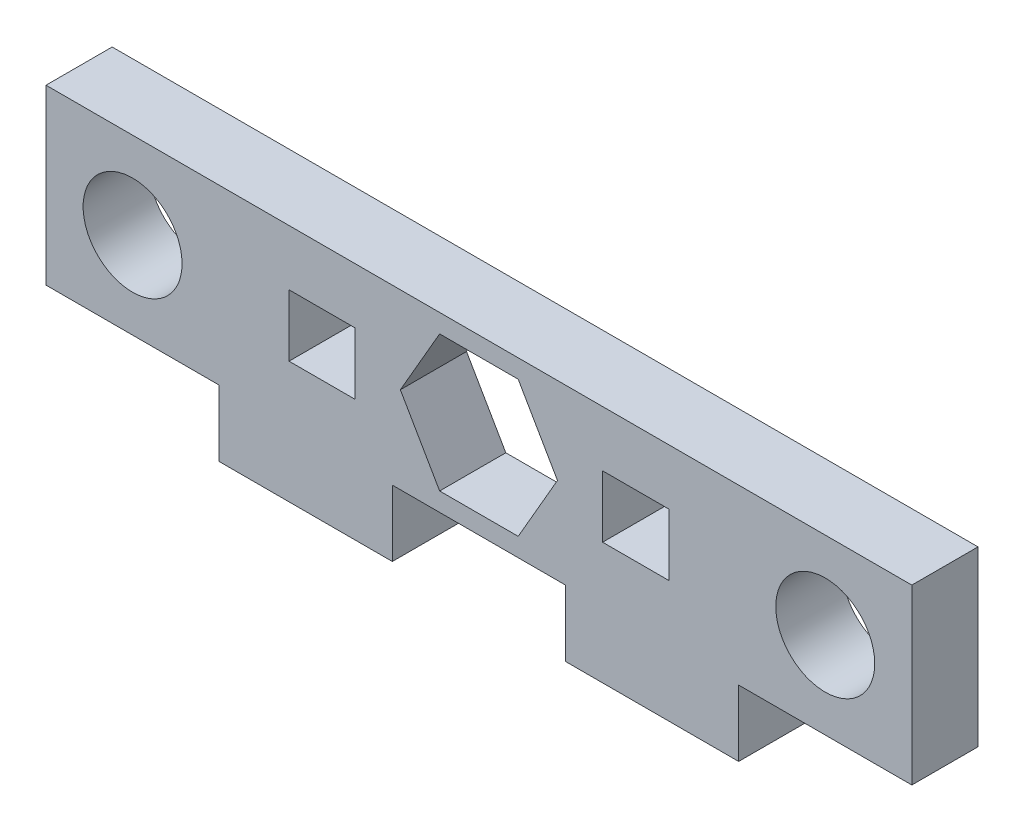
ISO-10303-21;
HEADER;
FILE_DESCRIPTION(('STEP AP214'),'2;1');
FILE_NAME('part.step','',(''),(''),'','','');
FILE_SCHEMA(('AUTOMOTIVE_DESIGN { 1 0 10303 214 1 1 1 1 }'));
ENDSEC;
DATA;
#1=APPLICATION_CONTEXT('core data for automotive mechanical design processes');
#2=APPLICATION_PROTOCOL_DEFINITION('international standard','automotive_design',2000,#1);
#3=PRODUCT_CONTEXT('',#1,'mechanical');
#4=PRODUCT('Part','Part','',(#3));
#5=PRODUCT_RELATED_PRODUCT_CATEGORY('part','',(#4));
#6=PRODUCT_DEFINITION_FORMATION('','',#4);
#7=PRODUCT_DEFINITION_CONTEXT('part definition',#1,'design');
#8=PRODUCT_DEFINITION('design','',#6,#7);
#9=PRODUCT_DEFINITION_SHAPE('','',#8);
#10=(LENGTH_UNIT() NAMED_UNIT(*) SI_UNIT(.MILLI.,.METRE.));
#11=(NAMED_UNIT(*) PLANE_ANGLE_UNIT() SI_UNIT($,.RADIAN.));
#12=(NAMED_UNIT(*) SI_UNIT($,.STERADIAN.) SOLID_ANGLE_UNIT());
#13=UNCERTAINTY_MEASURE_WITH_UNIT(LENGTH_MEASURE(1.E-05),#10,'distance_accuracy_value','');
#14=(GEOMETRIC_REPRESENTATION_CONTEXT(3) GLOBAL_UNCERTAINTY_ASSIGNED_CONTEXT((#13)) GLOBAL_UNIT_ASSIGNED_CONTEXT((#10,
#11,#12)) REPRESENTATION_CONTEXT('',''));
#15=CARTESIAN_POINT('',(0.,0.,0.));
#16=DIRECTION('',(0.,0.,1.));
#17=DIRECTION('',(1.,0.,0.));
#18=AXIS2_PLACEMENT_3D('',#15,#16,#17);
#19=CARTESIAN_POINT('',(0.,0.,5.35));
#20=DIRECTION('',(0.,0.,1.));
#21=DIRECTION('',(1.,0.,0.));
#22=AXIS2_PLACEMENT_3D('',#19,#20,#21);
#23=PLANE('',#22);
#24=CARTESIAN_POINT('',(7.00000029800002,12.3500002251,5.35));
#25=DIRECTION('',(0.,0.,1.));
#26=DIRECTION('',(1.,0.,0.));
#27=AXIS2_PLACEMENT_3D('',#24,#25,#26);
#28=CIRCLE('',#27,4.);
#29=CARTESIAN_POINT('',(11.000000298,12.3500002251,5.35));
#30=VERTEX_POINT('',#29);
#31=EDGE_CURVE('E325',#30,#30,#28,.T.);
#32=ORIENTED_EDGE('',*,*,#31,.F.);
#33=EDGE_LOOP('',(#32));
#34=FACE_BOUND('',#33,.T.);
#35=DIRECTION('',(1.,0.,0.));
#36=VECTOR('',#35,1.);
#37=CARTESIAN_POINT('',(55.9999998659001,5.3500002251,5.35));
#38=LINE('',#37,#36);
#39=CARTESIAN_POINT('',(55.9999998659001,5.3500002251,5.35));
#40=VERTEX_POINT('',#39);
#41=CARTESIAN_POINT('',(70.000000298,5.3500002251,5.35));
#42=VERTEX_POINT('',#41);
#43=EDGE_CURVE('E331',#40,#42,#38,.T.);
#44=ORIENTED_EDGE('',*,*,#43,.T.);
#45=DIRECTION('',(0.,1.,0.));
#46=VECTOR('',#45,1.);
#47=CARTESIAN_POINT('',(70.000000298,5.3500002251,5.35));
#48=LINE('',#47,#46);
#49=CARTESIAN_POINT('',(70.000000298,19.3500006572,5.35));
#50=VERTEX_POINT('',#49);
#51=EDGE_CURVE('E334',#42,#50,#48,.T.);
#52=ORIENTED_EDGE('',*,*,#51,.T.);
#53=DIRECTION('',(-1.,0.,0.));
#54=VECTOR('',#53,1.);
#55=CARTESIAN_POINT('',(70.000000298,19.3500006572,5.35));
#56=LINE('',#55,#54);
#57=CARTESIAN_POINT('',(0.,19.3500006572,5.35));
#58=VERTEX_POINT('',#57);
#59=EDGE_CURVE('E337',#50,#58,#56,.T.);
#60=ORIENTED_EDGE('',*,*,#59,.T.);
#61=DIRECTION('',(0.,-1.,0.));
#62=VECTOR('',#61,1.);
#63=CARTESIAN_POINT('',(0.,19.3500006572,5.35));
#64=LINE('',#63,#62);
#65=CARTESIAN_POINT('',(0.,5.3500002251,5.35));
#66=VERTEX_POINT('',#65);
#67=EDGE_CURVE('E339',#58,#66,#64,.T.);
#68=ORIENTED_EDGE('',*,*,#67,.T.);
#69=DIRECTION('',(1.,0.,0.));
#70=VECTOR('',#69,1.);
#71=CARTESIAN_POINT('',(0.,5.3500002251,5.35));
#72=LINE('',#71,#70);
#73=CARTESIAN_POINT('',(13.9999985695,5.3500002251,5.35));
#74=VERTEX_POINT('',#73);
#75=EDGE_CURVE('E341',#66,#74,#72,.T.);
#76=ORIENTED_EDGE('',*,*,#75,.T.);
#77=DIRECTION('',(0.,-1.,0.));
#78=VECTOR('',#77,1.);
#79=CARTESIAN_POINT('',(13.9999985695,5.3500002251,5.35));
#80=LINE('',#79,#78);
#81=CARTESIAN_POINT('',(13.9999985695,0.,5.35));
#82=VERTEX_POINT('',#81);
#83=EDGE_CURVE('E343',#74,#82,#80,.T.);
#84=ORIENTED_EDGE('',*,*,#83,.T.);
#85=DIRECTION('',(1.,0.,0.));
#86=VECTOR('',#85,1.);
#87=CARTESIAN_POINT('',(13.9999985695,0.,5.35));
#88=LINE('',#87,#86);
#89=CARTESIAN_POINT('',(28.0000008643001,0.,5.35));
#90=VERTEX_POINT('',#89);
#91=EDGE_CURVE('E345',#82,#90,#88,.T.);
#92=ORIENTED_EDGE('',*,*,#91,.T.);
#93=DIRECTION('',(0.,1.,0.));
#94=VECTOR('',#93,1.);
#95=CARTESIAN_POINT('',(28.0000008643001,0.,5.35));
#96=LINE('',#95,#94);
#97=CARTESIAN_POINT('',(28.0000008643001,5.3500002251,5.35));
#98=VERTEX_POINT('',#97);
#99=EDGE_CURVE('E347',#90,#98,#96,.T.);
#100=ORIENTED_EDGE('',*,*,#99,.T.);
#101=DIRECTION('',(1.,0.,0.));
#102=VECTOR('',#101,1.);
#103=CARTESIAN_POINT('',(28.0000008643001,5.3500002251,5.35));
#104=LINE('',#103,#102);
#105=CARTESIAN_POINT('',(41.9999994338,5.3500002251,5.35));
#106=VERTEX_POINT('',#105);
#107=EDGE_CURVE('E349',#98,#106,#104,.T.);
#108=ORIENTED_EDGE('',*,*,#107,.T.);
#109=DIRECTION('',(0.,-1.,0.));
#110=VECTOR('',#109,1.);
#111=CARTESIAN_POINT('',(41.9999994338,5.3500002251,5.35));
#112=LINE('',#111,#110);
#113=CARTESIAN_POINT('',(41.9999994338,0.,5.35));
#114=VERTEX_POINT('',#113);
#115=EDGE_CURVE('E351',#106,#114,#112,.T.);
#116=ORIENTED_EDGE('',*,*,#115,.T.);
#117=DIRECTION('',(1.,0.,0.));
#118=VECTOR('',#117,1.);
#119=CARTESIAN_POINT('',(41.9999994338,0.,5.35));
#120=LINE('',#119,#118);
#121=CARTESIAN_POINT('',(55.9999998659001,0.,5.35));
#122=VERTEX_POINT('',#121);
#123=EDGE_CURVE('E353',#114,#122,#120,.T.);
#124=ORIENTED_EDGE('',*,*,#123,.T.);
#125=DIRECTION('',(0.,1.,0.));
#126=VECTOR('',#125,1.);
#127=CARTESIAN_POINT('',(55.9999998659001,0.,5.35));
#128=LINE('',#127,#126);
#129=EDGE_CURVE('E355',#122,#40,#128,.T.);
#130=ORIENTED_EDGE('',*,*,#129,.T.);
#131=EDGE_LOOP('',(#44,#52,#60,#68,#76,#84,#92,#100,#108,#116,#124,#130));
#132=FACE_BOUND('',#131,.T.);
#133=CARTESIAN_POINT('',(63.0000002980001,12.3500002251,5.35));
#134=DIRECTION('',(0.,0.,1.));
#135=DIRECTION('',(1.,0.,0.));
#136=AXIS2_PLACEMENT_3D('',#133,#134,#135);
#137=CIRCLE('',#136,3.99999999999995);
#138=CARTESIAN_POINT('',(67.000000298,12.3500002251,5.35));
#139=VERTEX_POINT('',#138);
#140=EDGE_CURVE('E319',#139,#139,#137,.T.);
#141=ORIENTED_EDGE('',*,*,#140,.F.);
#142=EDGE_LOOP('',(#141));
#143=FACE_BOUND('',#142,.T.);
#144=DIRECTION('',(0.,-1.,0.));
#145=VECTOR('',#144,1.);
#146=CARTESIAN_POINT('',(44.9999999255,14.8499999196,5.35));
#147=LINE('',#146,#145);
#148=CARTESIAN_POINT('',(44.9999999255,14.8499999196,5.35));
#149=VERTEX_POINT('',#148);
#150=CARTESIAN_POINT('',(44.9999999255,9.8500000313,5.35));
#151=VERTEX_POINT('',#150);
#152=EDGE_CURVE('E290',#149,#151,#147,.T.);
#153=ORIENTED_EDGE('',*,*,#152,.F.);
#154=DIRECTION('',(-1.,0.,0.));
#155=VECTOR('',#154,1.);
#156=CARTESIAN_POINT('',(50.3500010818001,14.8499999196,5.35));
#157=LINE('',#156,#155);
#158=CARTESIAN_POINT('',(50.3500010818001,14.8499999196,5.35));
#159=VERTEX_POINT('',#158);
#160=EDGE_CURVE('E288',#159,#149,#157,.T.);
#161=ORIENTED_EDGE('',*,*,#160,.F.);
#162=DIRECTION('',(0.,1.,0.));
#163=VECTOR('',#162,1.);
#164=CARTESIAN_POINT('',(50.3500010818001,9.8500000313,5.35));
#165=LINE('',#164,#163);
#166=CARTESIAN_POINT('',(50.3500010818001,9.8500000313,5.35));
#167=VERTEX_POINT('',#166);
#168=EDGE_CURVE('E296',#167,#159,#165,.T.);
#169=ORIENTED_EDGE('',*,*,#168,.F.);
#170=DIRECTION('',(1.,0.,0.));
#171=VECTOR('',#170,1.);
#172=CARTESIAN_POINT('',(44.9999999255,9.8500000313,5.35));
#173=LINE('',#172,#171);
#174=EDGE_CURVE('E293',#151,#167,#173,.T.);
#175=ORIENTED_EDGE('',*,*,#174,.F.);
#176=EDGE_LOOP('',(#153,#161,#169,#175));
#177=FACE_BOUND('',#176,.T.);
#178=DIRECTION('',(0.,1.,0.));
#179=VECTOR('',#178,1.);
#180=CARTESIAN_POINT('',(24.9999985099001,9.8500000313,5.35));
#181=LINE('',#180,#179);
#182=CARTESIAN_POINT('',(24.9999985099001,9.8500000313,5.35));
#183=VERTEX_POINT('',#182);
#184=CARTESIAN_POINT('',(24.9999985099001,14.8499999196,5.35));
#185=VERTEX_POINT('',#184);
#186=EDGE_CURVE('E259',#183,#185,#181,.T.);
#187=ORIENTED_EDGE('',*,*,#186,.F.);
#188=DIRECTION('',(1.,0.,0.));
#189=VECTOR('',#188,1.);
#190=CARTESIAN_POINT('',(19.6500010789001,9.8500000313,5.35));
#191=LINE('',#190,#189);
#192=CARTESIAN_POINT('',(19.6500010789001,9.8500000313,5.35));
#193=VERTEX_POINT('',#192);
#194=EDGE_CURVE('E257',#193,#183,#191,.T.);
#195=ORIENTED_EDGE('',*,*,#194,.F.);
#196=DIRECTION('',(0.,-1.,0.));
#197=VECTOR('',#196,1.);
#198=CARTESIAN_POINT('',(19.6500010789001,14.8499999196,5.35));
#199=LINE('',#198,#197);
#200=CARTESIAN_POINT('',(19.6500010789001,14.8499999196,5.35));
#201=VERTEX_POINT('',#200);
#202=EDGE_CURVE('E265',#201,#193,#199,.T.);
#203=ORIENTED_EDGE('',*,*,#202,.F.);
#204=DIRECTION('',(-1.,0.,0.));
#205=VECTOR('',#204,1.);
#206=CARTESIAN_POINT('',(24.9999985099001,14.8499999196,5.35));
#207=LINE('',#206,#205);
#208=EDGE_CURVE('E262',#185,#201,#207,.T.);
#209=ORIENTED_EDGE('',*,*,#208,.F.);
#210=EDGE_LOOP('',(#187,#195,#203,#209));
#211=FACE_BOUND('',#210,.T.);
#212=DIRECTION('',(-0.499999977699308,0.866025416659749,0.));
#213=VECTOR('',#212,1.);
#214=CARTESIAN_POINT('',(41.3508526981,12.3500004411,5.35));
#215=LINE('',#214,#213);
#216=CARTESIAN_POINT('',(41.3508526981,12.3500004411,5.35));
#217=VERTEX_POINT('',#216);
#218=CARTESIAN_POINT('',(38.1754264236,17.8500004113,5.35));
#219=VERTEX_POINT('',#218);
#220=EDGE_CURVE('E214',#217,#219,#215,.T.);
#221=ORIENTED_EDGE('',*,*,#220,.F.);
#222=DIRECTION('',(0.499999961826581,0.866025425823872,0.));
#223=VECTOR('',#222,1.);
#224=CARTESIAN_POINT('',(38.1754264236,6.8500002381,5.35));
#225=LINE('',#224,#223);
#226=CARTESIAN_POINT('',(38.1754264236,6.8500002381,5.35));
#227=VERTEX_POINT('',#226);
#228=EDGE_CURVE('E206',#227,#217,#225,.T.);
#229=ORIENTED_EDGE('',*,*,#228,.F.);
#230=DIRECTION('',(1.,0.,0.));
#231=VECTOR('',#230,1.);
#232=CARTESIAN_POINT('',(31.8245738745,6.8500002381,5.35));
#233=LINE('',#232,#231);
#234=CARTESIAN_POINT('',(31.8245738745,6.8500002381,5.35));
#235=VERTEX_POINT('',#234);
#236=EDGE_CURVE('E235',#235,#227,#233,.T.);
#237=ORIENTED_EDGE('',*,*,#236,.F.);
#238=DIRECTION('',(0.499999961826574,-0.866025425823875,0.));
#239=VECTOR('',#238,1.);
#240=CARTESIAN_POINT('',(28.6491476,12.3500004411,5.35));
#241=LINE('',#240,#239);
#242=CARTESIAN_POINT('',(28.6491476,12.3500004411,5.35));
#243=VERTEX_POINT('',#242);
#244=EDGE_CURVE('E233',#243,#235,#241,.T.);
#245=ORIENTED_EDGE('',*,*,#244,.F.);
#246=DIRECTION('',(-0.499999977699301,-0.866025416659753,0.));
#247=VECTOR('',#246,1.);
#248=CARTESIAN_POINT('',(31.8245738745,17.8500004113,5.35));
#249=LINE('',#248,#247);
#250=CARTESIAN_POINT('',(31.8245738745,17.8500004113,5.35));
#251=VERTEX_POINT('',#250);
#252=EDGE_CURVE('E229',#251,#243,#249,.T.);
#253=ORIENTED_EDGE('',*,*,#252,.F.);
#254=DIRECTION('',(-1.,0.,0.));
#255=VECTOR('',#254,1.);
#256=CARTESIAN_POINT('',(38.1754264236,17.8500004113,5.35));
#257=LINE('',#256,#255);
#258=EDGE_CURVE('E227',#219,#251,#257,.T.);
#259=ORIENTED_EDGE('',*,*,#258,.F.);
#260=EDGE_LOOP('',(#221,#229,#237,#245,#253,#259));
#261=FACE_BOUND('',#260,.T.);
#262=ADVANCED_FACE('F33',(#34,#132,#143,#177,#211,#261),#23,.T.);
#263=CARTESIAN_POINT('',(0.,0.,0.));
#264=DIRECTION('',(0.,0.,1.));
#265=DIRECTION('',(1.,0.,0.));
#266=AXIS2_PLACEMENT_3D('',#263,#264,#265);
#267=PLANE('',#266);
#268=DIRECTION('',(1.,0.,0.));
#269=VECTOR('',#268,1.);
#270=CARTESIAN_POINT('',(19.6500010789001,9.8500000313,0.));
#271=LINE('',#270,#269);
#272=CARTESIAN_POINT('',(19.6500010789001,9.8500000313,0.));
#273=VERTEX_POINT('',#272);
#274=CARTESIAN_POINT('',(24.9999985099001,9.8500000313,0.));
#275=VERTEX_POINT('',#274);
#276=EDGE_CURVE('E222',#273,#275,#271,.T.);
#277=ORIENTED_EDGE('',*,*,#276,.T.);
#278=DIRECTION('',(0.,1.,0.));
#279=VECTOR('',#278,1.);
#280=CARTESIAN_POINT('',(24.9999985099001,9.8500000313,0.));
#281=LINE('',#280,#279);
#282=CARTESIAN_POINT('',(24.9999985099001,14.8499999196,0.));
#283=VERTEX_POINT('',#282);
#284=EDGE_CURVE('E270',#275,#283,#281,.T.);
#285=ORIENTED_EDGE('',*,*,#284,.T.);
#286=DIRECTION('',(-1.,0.,0.));
#287=VECTOR('',#286,1.);
#288=CARTESIAN_POINT('',(24.9999985099001,14.8499999196,0.));
#289=LINE('',#288,#287);
#290=CARTESIAN_POINT('',(19.6500010789001,14.8499999196,0.));
#291=VERTEX_POINT('',#290);
#292=EDGE_CURVE('E273',#283,#291,#289,.T.);
#293=ORIENTED_EDGE('',*,*,#292,.T.);
#294=DIRECTION('',(0.,-1.,0.));
#295=VECTOR('',#294,1.);
#296=CARTESIAN_POINT('',(19.6500010789001,14.8499999196,0.));
#297=LINE('',#296,#295);
#298=EDGE_CURVE('E260',#291,#273,#297,.T.);
#299=ORIENTED_EDGE('',*,*,#298,.T.);
#300=EDGE_LOOP('',(#277,#285,#293,#299));
#301=FACE_BOUND('',#300,.T.);
#302=CARTESIAN_POINT('',(63.0000002980001,12.3500002251,0.));
#303=DIRECTION('',(0.,0.,1.));
#304=DIRECTION('',(1.,0.,0.));
#305=AXIS2_PLACEMENT_3D('',#302,#303,#304);
#306=CIRCLE('',#305,3.99999999999995);
#307=CARTESIAN_POINT('',(67.000000298,12.3500002251,0.));
#308=VERTEX_POINT('',#307);
#309=EDGE_CURVE('E318',#308,#308,#306,.T.);
#310=ORIENTED_EDGE('',*,*,#309,.T.);
#311=EDGE_LOOP('',(#310));
#312=FACE_BOUND('',#311,.T.);
#313=CARTESIAN_POINT('',(7.00000029800002,12.3500002251,0.));
#314=DIRECTION('',(0.,0.,1.));
#315=DIRECTION('',(1.,0.,0.));
#316=AXIS2_PLACEMENT_3D('',#313,#314,#315);
#317=CIRCLE('',#316,4.);
#318=CARTESIAN_POINT('',(11.000000298,12.3500002251,0.));
#319=VERTEX_POINT('',#318);
#320=EDGE_CURVE('E322',#319,#319,#317,.T.);
#321=ORIENTED_EDGE('',*,*,#320,.T.);
#322=EDGE_LOOP('',(#321));
#323=FACE_BOUND('',#322,.T.);
#324=DIRECTION('',(1.,0.,0.));
#325=VECTOR('',#324,1.);
#326=CARTESIAN_POINT('',(55.9999998659001,5.3500002251,0.));
#327=LINE('',#326,#325);
#328=CARTESIAN_POINT('',(55.9999998659001,5.3500002251,0.));
#329=VERTEX_POINT('',#328);
#330=CARTESIAN_POINT('',(70.000000298,5.3500002251,0.));
#331=VERTEX_POINT('',#330);
#332=EDGE_CURVE('E328',#329,#331,#327,.T.);
#333=ORIENTED_EDGE('',*,*,#332,.F.);
#334=DIRECTION('',(0.,1.,0.));
#335=VECTOR('',#334,1.);
#336=CARTESIAN_POINT('',(55.9999998659001,0.,0.));
#337=LINE('',#336,#335);
#338=CARTESIAN_POINT('',(55.9999998659001,0.,0.));
#339=VERTEX_POINT('',#338);
#340=EDGE_CURVE('E335',#339,#329,#337,.T.);
#341=ORIENTED_EDGE('',*,*,#340,.F.);
#342=DIRECTION('',(1.,0.,0.));
#343=VECTOR('',#342,1.);
#344=CARTESIAN_POINT('',(41.9999994338,0.,0.));
#345=LINE('',#344,#343);
#346=CARTESIAN_POINT('',(41.9999994338,0.,0.));
#347=VERTEX_POINT('',#346);
#348=EDGE_CURVE('E378',#347,#339,#345,.T.);
#349=ORIENTED_EDGE('',*,*,#348,.F.);
#350=DIRECTION('',(0.,-1.,0.));
#351=VECTOR('',#350,1.);
#352=CARTESIAN_POINT('',(41.9999994338,5.3500002251,0.));
#353=LINE('',#352,#351);
#354=CARTESIAN_POINT('',(41.9999994338,5.3500002251,0.));
#355=VERTEX_POINT('',#354);
#356=EDGE_CURVE('E376',#355,#347,#353,.T.);
#357=ORIENTED_EDGE('',*,*,#356,.F.);
#358=DIRECTION('',(1.,0.,0.));
#359=VECTOR('',#358,1.);
#360=CARTESIAN_POINT('',(28.0000008643001,5.3500002251,0.));
#361=LINE('',#360,#359);
#362=CARTESIAN_POINT('',(28.0000008643001,5.3500002251,0.));
#363=VERTEX_POINT('',#362);
#364=EDGE_CURVE('E374',#363,#355,#361,.T.);
#365=ORIENTED_EDGE('',*,*,#364,.F.);
#366=DIRECTION('',(0.,1.,0.));
#367=VECTOR('',#366,1.);
#368=CARTESIAN_POINT('',(28.0000008643001,0.,0.));
#369=LINE('',#368,#367);
#370=CARTESIAN_POINT('',(28.0000008643001,0.,0.));
#371=VERTEX_POINT('',#370);
#372=EDGE_CURVE('E372',#371,#363,#369,.T.);
#373=ORIENTED_EDGE('',*,*,#372,.F.);
#374=DIRECTION('',(1.,0.,0.));
#375=VECTOR('',#374,1.);
#376=CARTESIAN_POINT('',(13.9999985695,0.,0.));
#377=LINE('',#376,#375);
#378=CARTESIAN_POINT('',(13.9999985695,0.,0.));
#379=VERTEX_POINT('',#378);
#380=EDGE_CURVE('E370',#379,#371,#377,.T.);
#381=ORIENTED_EDGE('',*,*,#380,.F.);
#382=DIRECTION('',(0.,-1.,0.));
#383=VECTOR('',#382,1.);
#384=CARTESIAN_POINT('',(13.9999985695,5.3500002251,0.));
#385=LINE('',#384,#383);
#386=CARTESIAN_POINT('',(13.9999985695,5.3500002251,0.));
#387=VERTEX_POINT('',#386);
#388=EDGE_CURVE('E368',#387,#379,#385,.T.);
#389=ORIENTED_EDGE('',*,*,#388,.F.);
#390=DIRECTION('',(1.,0.,0.));
#391=VECTOR('',#390,1.);
#392=CARTESIAN_POINT('',(0.,5.3500002251,0.));
#393=LINE('',#392,#391);
#394=CARTESIAN_POINT('',(0.,5.3500002251,0.));
#395=VERTEX_POINT('',#394);
#396=EDGE_CURVE('E366',#395,#387,#393,.T.);
#397=ORIENTED_EDGE('',*,*,#396,.F.);
#398=DIRECTION('',(0.,-1.,0.));
#399=VECTOR('',#398,1.);
#400=CARTESIAN_POINT('',(0.,19.3500006572,0.));
#401=LINE('',#400,#399);
#402=CARTESIAN_POINT('',(0.,19.3500006572,0.));
#403=VERTEX_POINT('',#402);
#404=EDGE_CURVE('E364',#403,#395,#401,.T.);
#405=ORIENTED_EDGE('',*,*,#404,.F.);
#406=DIRECTION('',(-1.,0.,0.));
#407=VECTOR('',#406,1.);
#408=CARTESIAN_POINT('',(70.000000298,19.3500006572,0.));
#409=LINE('',#408,#407);
#410=CARTESIAN_POINT('',(70.000000298,19.3500006572,0.));
#411=VERTEX_POINT('',#410);
#412=EDGE_CURVE('E362',#411,#403,#409,.T.);
#413=ORIENTED_EDGE('',*,*,#412,.F.);
#414=DIRECTION('',(0.,1.,0.));
#415=VECTOR('',#414,1.);
#416=CARTESIAN_POINT('',(70.000000298,5.3500002251,0.));
#417=LINE('',#416,#415);
#418=EDGE_CURVE('E360',#331,#411,#417,.T.);
#419=ORIENTED_EDGE('',*,*,#418,.F.);
#420=EDGE_LOOP('',(#333,#341,#349,#357,#365,#373,#381,#389,#397,#405,#413,#419));
#421=FACE_BOUND('',#420,.T.);
#422=DIRECTION('',(-1.,0.,0.));
#423=VECTOR('',#422,1.);
#424=CARTESIAN_POINT('',(50.3500010818001,14.8499999196,0.));
#425=LINE('',#424,#423);
#426=CARTESIAN_POINT('',(50.3500010818001,14.8499999196,0.));
#427=VERTEX_POINT('',#426);
#428=CARTESIAN_POINT('',(44.9999999255,14.8499999196,0.));
#429=VERTEX_POINT('',#428);
#430=EDGE_CURVE('E287',#427,#429,#425,.T.);
#431=ORIENTED_EDGE('',*,*,#430,.T.);
#432=DIRECTION('',(0.,-1.,0.));
#433=VECTOR('',#432,1.);
#434=CARTESIAN_POINT('',(44.9999999255,14.8499999196,0.));
#435=LINE('',#434,#433);
#436=CARTESIAN_POINT('',(44.9999999255,9.8500000313,0.));
#437=VERTEX_POINT('',#436);
#438=EDGE_CURVE('E301',#429,#437,#435,.T.);
#439=ORIENTED_EDGE('',*,*,#438,.T.);
#440=DIRECTION('',(1.,0.,0.));
#441=VECTOR('',#440,1.);
#442=CARTESIAN_POINT('',(44.9999999255,9.8500000313,0.));
#443=LINE('',#442,#441);
#444=CARTESIAN_POINT('',(50.3500010818001,9.8500000313,0.));
#445=VERTEX_POINT('',#444);
#446=EDGE_CURVE('E304',#437,#445,#443,.T.);
#447=ORIENTED_EDGE('',*,*,#446,.T.);
#448=DIRECTION('',(0.,1.,0.));
#449=VECTOR('',#448,1.);
#450=CARTESIAN_POINT('',(50.3500010818001,9.8500000313,0.));
#451=LINE('',#450,#449);
#452=EDGE_CURVE('E291',#445,#427,#451,.T.);
#453=ORIENTED_EDGE('',*,*,#452,.T.);
#454=EDGE_LOOP('',(#431,#439,#447,#453));
#455=FACE_BOUND('',#454,.T.);
#456=DIRECTION('',(0.499999961826581,0.866025425823872,0.));
#457=VECTOR('',#456,1.);
#458=CARTESIAN_POINT('',(38.1754264236,6.8500002381,0.));
#459=LINE('',#458,#457);
#460=CARTESIAN_POINT('',(38.1754264236,6.8500002381,0.));
#461=VERTEX_POINT('',#460);
#462=CARTESIAN_POINT('',(41.3508526981,12.3500004411,0.));
#463=VERTEX_POINT('',#462);
#464=EDGE_CURVE('E56',#461,#463,#459,.T.);
#465=ORIENTED_EDGE('',*,*,#464,.T.);
#466=DIRECTION('',(-0.499999977699308,0.866025416659749,0.));
#467=VECTOR('',#466,1.);
#468=CARTESIAN_POINT('',(41.3508526981,12.3500004411,0.));
#469=LINE('',#468,#467);
#470=CARTESIAN_POINT('',(38.1754264236,17.8500004113,0.));
#471=VERTEX_POINT('',#470);
#472=EDGE_CURVE('E221',#463,#471,#469,.T.);
#473=ORIENTED_EDGE('',*,*,#472,.T.);
#474=DIRECTION('',(-1.,0.,0.));
#475=VECTOR('',#474,1.);
#476=CARTESIAN_POINT('',(38.1754264236,17.8500004113,0.));
#477=LINE('',#476,#475);
#478=CARTESIAN_POINT('',(31.8245738745,17.8500004113,0.));
#479=VERTEX_POINT('',#478);
#480=EDGE_CURVE('E239',#471,#479,#477,.T.);
#481=ORIENTED_EDGE('',*,*,#480,.T.);
#482=DIRECTION('',(-0.499999977699301,-0.866025416659753,0.));
#483=VECTOR('',#482,1.);
#484=CARTESIAN_POINT('',(31.8245738745,17.8500004113,0.));
#485=LINE('',#484,#483);
#486=CARTESIAN_POINT('',(28.6491476,12.3500004411,0.));
#487=VERTEX_POINT('',#486);
#488=EDGE_CURVE('E242',#479,#487,#485,.T.);
#489=ORIENTED_EDGE('',*,*,#488,.T.);
#490=DIRECTION('',(0.499999961826574,-0.866025425823875,0.));
#491=VECTOR('',#490,1.);
#492=CARTESIAN_POINT('',(28.6491476,12.3500004411,0.));
#493=LINE('',#492,#491);
#494=CARTESIAN_POINT('',(31.8245738745,6.8500002381,0.));
#495=VERTEX_POINT('',#494);
#496=EDGE_CURVE('E245',#487,#495,#493,.T.);
#497=ORIENTED_EDGE('',*,*,#496,.T.);
#498=DIRECTION('',(1.,0.,0.));
#499=VECTOR('',#498,1.);
#500=CARTESIAN_POINT('',(31.8245738745,6.8500002381,0.));
#501=LINE('',#500,#499);
#502=EDGE_CURVE('E215',#495,#461,#501,.T.);
#503=ORIENTED_EDGE('',*,*,#502,.T.);
#504=EDGE_LOOP('',(#465,#473,#481,#489,#497,#503));
#505=FACE_BOUND('',#504,.T.);
#506=ADVANCED_FACE('F420',(#301,#312,#323,#421,#455,#505),#267,.F.);
#507=CARTESIAN_POINT('',(55.9999998659001,5.3500002251,5.35));
#508=DIRECTION('',(0.,1.,0.));
#509=DIRECTION('',(0.,0.,1.));
#510=AXIS2_PLACEMENT_3D('',#507,#508,#509);
#511=PLANE('',#510);
#512=ORIENTED_EDGE('',*,*,#332,.T.);
#513=DIRECTION('',(0.,0.,-1.));
#514=VECTOR('',#513,1.);
#515=CARTESIAN_POINT('',(70.000000298,5.3500002251,5.35));
#516=LINE('',#515,#514);
#517=EDGE_CURVE('E11',#42,#331,#516,.T.);
#518=ORIENTED_EDGE('',*,*,#517,.F.);
#519=ORIENTED_EDGE('',*,*,#43,.F.);
#520=DIRECTION('',(0.,0.,-1.));
#521=VECTOR('',#520,1.);
#522=CARTESIAN_POINT('',(55.9999998659001,5.3500002251,5.35));
#523=LINE('',#522,#521);
#524=EDGE_CURVE('E357',#40,#329,#523,.T.);
#525=ORIENTED_EDGE('',*,*,#524,.T.);
#526=EDGE_LOOP('',(#512,#518,#519,#525));
#527=FACE_BOUND('',#526,.T.);
#528=ADVANCED_FACE('F35',(#527),#511,.F.);
#529=CARTESIAN_POINT('',(70.000000298,5.3500002251,5.35));
#530=DIRECTION('',(-1.,0.,0.));
#531=DIRECTION('',(0.,0.,1.));
#532=AXIS2_PLACEMENT_3D('',#529,#530,#531);
#533=PLANE('',#532);
#534=ORIENTED_EDGE('',*,*,#418,.T.);
#535=DIRECTION('',(0.,0.,-1.));
#536=VECTOR('',#535,1.);
#537=CARTESIAN_POINT('',(70.000000298,19.3500006572,5.35));
#538=LINE('',#537,#536);
#539=EDGE_CURVE('E41',#50,#411,#538,.T.);
#540=ORIENTED_EDGE('',*,*,#539,.F.);
#541=ORIENTED_EDGE('',*,*,#51,.F.);
#542=ORIENTED_EDGE('',*,*,#517,.T.);
#543=EDGE_LOOP('',(#534,#540,#541,#542));
#544=FACE_BOUND('',#543,.T.);
#545=ADVANCED_FACE('F438',(#544),#533,.F.);
#546=CARTESIAN_POINT('',(70.000000298,19.3500006572,5.35));
#547=DIRECTION('',(0.,-1.,0.));
#548=DIRECTION('',(0.,0.,-1.));
#549=AXIS2_PLACEMENT_3D('',#546,#547,#548);
#550=PLANE('',#549);
#551=ORIENTED_EDGE('',*,*,#412,.T.);
#552=DIRECTION('',(0.,0.,-1.));
#553=VECTOR('',#552,1.);
#554=CARTESIAN_POINT('',(0.,19.3500006572,5.35));
#555=LINE('',#554,#553);
#556=EDGE_CURVE('E407',#58,#403,#555,.T.);
#557=ORIENTED_EDGE('',*,*,#556,.F.);
#558=ORIENTED_EDGE('',*,*,#59,.F.);
#559=ORIENTED_EDGE('',*,*,#539,.T.);
#560=EDGE_LOOP('',(#551,#557,#558,#559));
#561=FACE_BOUND('',#560,.T.);
#562=ADVANCED_FACE('F414',(#561),#550,.F.);
#563=CARTESIAN_POINT('',(0.,19.3500006572,5.35));
#564=DIRECTION('',(1.,0.,0.));
#565=DIRECTION('',(0.,0.,-1.));
#566=AXIS2_PLACEMENT_3D('',#563,#564,#565);
#567=PLANE('',#566);
#568=ORIENTED_EDGE('',*,*,#404,.T.);
#569=DIRECTION('',(0.,0.,-1.));
#570=VECTOR('',#569,1.);
#571=CARTESIAN_POINT('',(0.,5.3500002251,5.35));
#572=LINE('',#571,#570);
#573=EDGE_CURVE('E404',#66,#395,#572,.T.);
#574=ORIENTED_EDGE('',*,*,#573,.F.);
#575=ORIENTED_EDGE('',*,*,#67,.F.);
#576=ORIENTED_EDGE('',*,*,#556,.T.);
#577=EDGE_LOOP('',(#568,#574,#575,#576));
#578=FACE_BOUND('',#577,.T.);
#579=ADVANCED_FACE('F426',(#578),#567,.F.);
#580=CARTESIAN_POINT('',(0.,5.3500002251,5.35));
#581=DIRECTION('',(0.,1.,0.));
#582=DIRECTION('',(0.,0.,1.));
#583=AXIS2_PLACEMENT_3D('',#580,#581,#582);
#584=PLANE('',#583);
#585=ORIENTED_EDGE('',*,*,#396,.T.);
#586=DIRECTION('',(0.,0.,-1.));
#587=VECTOR('',#586,1.);
#588=CARTESIAN_POINT('',(13.9999985695,5.3500002251,5.35));
#589=LINE('',#588,#587);
#590=EDGE_CURVE('E401',#74,#387,#589,.T.);
#591=ORIENTED_EDGE('',*,*,#590,.F.);
#592=ORIENTED_EDGE('',*,*,#75,.F.);
#593=ORIENTED_EDGE('',*,*,#573,.T.);
#594=EDGE_LOOP('',(#585,#591,#592,#593));
#595=FACE_BOUND('',#594,.T.);
#596=ADVANCED_FACE('F430',(#595),#584,.F.);
#597=CARTESIAN_POINT('',(13.9999985695,5.3500002251,5.35));
#598=DIRECTION('',(1.,0.,0.));
#599=DIRECTION('',(0.,0.,-1.));
#600=AXIS2_PLACEMENT_3D('',#597,#598,#599);
#601=PLANE('',#600);
#602=ORIENTED_EDGE('',*,*,#388,.T.);
#603=DIRECTION('',(0.,0.,-1.));
#604=VECTOR('',#603,1.);
#605=CARTESIAN_POINT('',(13.9999985695,0.,5.35));
#606=LINE('',#605,#604);
#607=EDGE_CURVE('E398',#82,#379,#606,.T.);
#608=ORIENTED_EDGE('',*,*,#607,.F.);
#609=ORIENTED_EDGE('',*,*,#83,.F.);
#610=ORIENTED_EDGE('',*,*,#590,.T.);
#611=EDGE_LOOP('',(#602,#608,#609,#610));
#612=FACE_BOUND('',#611,.T.);
#613=ADVANCED_FACE('F471',(#612),#601,.F.);
#614=CARTESIAN_POINT('',(13.9999985695,0.,5.35));
#615=DIRECTION('',(0.,1.,0.));
#616=DIRECTION('',(0.,0.,1.));
#617=AXIS2_PLACEMENT_3D('',#614,#615,#616);
#618=PLANE('',#617);
#619=ORIENTED_EDGE('',*,*,#380,.T.);
#620=DIRECTION('',(0.,0.,-1.));
#621=VECTOR('',#620,1.);
#622=CARTESIAN_POINT('',(28.0000008643001,0.,5.35));
#623=LINE('',#622,#621);
#624=EDGE_CURVE('E395',#90,#371,#623,.T.);
#625=ORIENTED_EDGE('',*,*,#624,.F.);
#626=ORIENTED_EDGE('',*,*,#91,.F.);
#627=ORIENTED_EDGE('',*,*,#607,.T.);
#628=EDGE_LOOP('',(#619,#625,#626,#627));
#629=FACE_BOUND('',#628,.T.);
#630=ADVANCED_FACE('F469',(#629),#618,.F.);
#631=CARTESIAN_POINT('',(28.0000008643001,0.,5.35));
#632=DIRECTION('',(-1.,0.,0.));
#633=DIRECTION('',(0.,0.,1.));
#634=AXIS2_PLACEMENT_3D('',#631,#632,#633);
#635=PLANE('',#634);
#636=ORIENTED_EDGE('',*,*,#372,.T.);
#637=DIRECTION('',(0.,0.,-1.));
#638=VECTOR('',#637,1.);
#639=CARTESIAN_POINT('',(28.0000008643001,5.3500002251,5.35));
#640=LINE('',#639,#638);
#641=EDGE_CURVE('E392',#98,#363,#640,.T.);
#642=ORIENTED_EDGE('',*,*,#641,.F.);
#643=ORIENTED_EDGE('',*,*,#99,.F.);
#644=ORIENTED_EDGE('',*,*,#624,.T.);
#645=EDGE_LOOP('',(#636,#642,#643,#644));
#646=FACE_BOUND('',#645,.T.);
#647=ADVANCED_FACE('F465',(#646),#635,.F.);
#648=CARTESIAN_POINT('',(28.0000008643001,5.3500002251,5.35));
#649=DIRECTION('',(0.,1.,0.));
#650=DIRECTION('',(0.,0.,1.));
#651=AXIS2_PLACEMENT_3D('',#648,#649,#650);
#652=PLANE('',#651);
#653=ORIENTED_EDGE('',*,*,#364,.T.);
#654=DIRECTION('',(0.,0.,-1.));
#655=VECTOR('',#654,1.);
#656=CARTESIAN_POINT('',(41.9999994338,5.3500002251,5.35));
#657=LINE('',#656,#655);
#658=EDGE_CURVE('E389',#106,#355,#657,.T.);
#659=ORIENTED_EDGE('',*,*,#658,.F.);
#660=ORIENTED_EDGE('',*,*,#107,.F.);
#661=ORIENTED_EDGE('',*,*,#641,.T.);
#662=EDGE_LOOP('',(#653,#659,#660,#661));
#663=FACE_BOUND('',#662,.T.);
#664=ADVANCED_FACE('F460',(#663),#652,.F.);
#665=CARTESIAN_POINT('',(41.9999994338,5.3500002251,5.35));
#666=DIRECTION('',(1.,0.,0.));
#667=DIRECTION('',(0.,0.,-1.));
#668=AXIS2_PLACEMENT_3D('',#665,#666,#667);
#669=PLANE('',#668);
#670=ORIENTED_EDGE('',*,*,#356,.T.);
#671=DIRECTION('',(0.,0.,-1.));
#672=VECTOR('',#671,1.);
#673=CARTESIAN_POINT('',(41.9999994338,0.,5.35));
#674=LINE('',#673,#672);
#675=EDGE_CURVE('E386',#114,#347,#674,.T.);
#676=ORIENTED_EDGE('',*,*,#675,.F.);
#677=ORIENTED_EDGE('',*,*,#115,.F.);
#678=ORIENTED_EDGE('',*,*,#658,.T.);
#679=EDGE_LOOP('',(#670,#676,#677,#678));
#680=FACE_BOUND('',#679,.T.);
#681=ADVANCED_FACE('F454',(#680),#669,.F.);
#682=CARTESIAN_POINT('',(41.9999994338,0.,5.35));
#683=DIRECTION('',(0.,1.,0.));
#684=DIRECTION('',(0.,0.,1.));
#685=AXIS2_PLACEMENT_3D('',#682,#683,#684);
#686=PLANE('',#685);
#687=ORIENTED_EDGE('',*,*,#348,.T.);
#688=DIRECTION('',(0.,0.,-1.));
#689=VECTOR('',#688,1.);
#690=CARTESIAN_POINT('',(55.9999998659001,0.,5.35));
#691=LINE('',#690,#689);
#692=EDGE_CURVE('E383',#122,#339,#691,.T.);
#693=ORIENTED_EDGE('',*,*,#692,.F.);
#694=ORIENTED_EDGE('',*,*,#123,.F.);
#695=ORIENTED_EDGE('',*,*,#675,.T.);
#696=EDGE_LOOP('',(#687,#693,#694,#695));
#697=FACE_BOUND('',#696,.T.);
#698=ADVANCED_FACE('F450',(#697),#686,.F.);
#699=CARTESIAN_POINT('',(55.9999998659001,0.,5.35));
#700=DIRECTION('',(-1.,0.,0.));
#701=DIRECTION('',(0.,0.,1.));
#702=AXIS2_PLACEMENT_3D('',#699,#700,#701);
#703=PLANE('',#702);
#704=ORIENTED_EDGE('',*,*,#340,.T.);
#705=ORIENTED_EDGE('',*,*,#524,.F.);
#706=ORIENTED_EDGE('',*,*,#129,.F.);
#707=ORIENTED_EDGE('',*,*,#692,.T.);
#708=EDGE_LOOP('',(#704,#705,#706,#707));
#709=FACE_BOUND('',#708,.T.);
#710=ADVANCED_FACE('F445',(#709),#703,.F.);
#711=CARTESIAN_POINT('',(7.00000029800002,12.3500002251,5.35));
#712=DIRECTION('',(0.,0.,-1.));
#713=DIRECTION('',(-1.,0.,0.));
#714=AXIS2_PLACEMENT_3D('',#711,#712,#713);
#715=CYLINDRICAL_SURFACE('',#714,4.);
#716=ORIENTED_EDGE('',*,*,#31,.T.);
#717=EDGE_LOOP('',(#716));
#718=FACE_BOUND('',#717,.T.);
#719=ORIENTED_EDGE('',*,*,#320,.F.);
#720=EDGE_LOOP('',(#719));
#721=FACE_BOUND('',#720,.T.);
#722=ADVANCED_FACE('F490',(#718,#721),#715,.F.);
#723=CARTESIAN_POINT('',(63.0000002980001,12.3500002251,5.35));
#724=DIRECTION('',(0.,0.,-1.));
#725=DIRECTION('',(-1.,0.,0.));
#726=AXIS2_PLACEMENT_3D('',#723,#724,#725);
#727=CYLINDRICAL_SURFACE('',#726,3.99999999999995);
#728=ORIENTED_EDGE('',*,*,#140,.T.);
#729=EDGE_LOOP('',(#728));
#730=FACE_BOUND('',#729,.T.);
#731=ORIENTED_EDGE('',*,*,#309,.F.);
#732=EDGE_LOOP('',(#731));
#733=FACE_BOUND('',#732,.T.);
#734=ADVANCED_FACE('F528',(#730,#733),#727,.F.);
#735=CARTESIAN_POINT('',(50.3500010818001,14.8499999196,5.35));
#736=DIRECTION('',(0.,-1.,0.));
#737=DIRECTION('',(0.,0.,-1.));
#738=AXIS2_PLACEMENT_3D('',#735,#736,#737);
#739=PLANE('',#738);
#740=ORIENTED_EDGE('',*,*,#430,.F.);
#741=DIRECTION('',(0.,0.,-1.));
#742=VECTOR('',#741,1.);
#743=CARTESIAN_POINT('',(50.3500010818001,14.8499999196,5.35));
#744=LINE('',#743,#742);
#745=EDGE_CURVE('E298',#159,#427,#744,.T.);
#746=ORIENTED_EDGE('',*,*,#745,.F.);
#747=ORIENTED_EDGE('',*,*,#160,.T.);
#748=DIRECTION('',(0.,0.,-1.));
#749=VECTOR('',#748,1.);
#750=CARTESIAN_POINT('',(44.9999999255,14.8499999196,5.35));
#751=LINE('',#750,#749);
#752=EDGE_CURVE('E315',#149,#429,#751,.T.);
#753=ORIENTED_EDGE('',*,*,#752,.T.);
#754=EDGE_LOOP('',(#740,#746,#747,#753));
#755=FACE_BOUND('',#754,.T.);
#756=ADVANCED_FACE('F535',(#755),#739,.T.);
#757=CARTESIAN_POINT('',(44.9999999255,14.8499999196,5.35));
#758=DIRECTION('',(1.,0.,0.));
#759=DIRECTION('',(0.,0.,-1.));
#760=AXIS2_PLACEMENT_3D('',#757,#758,#759);
#761=PLANE('',#760);
#762=ORIENTED_EDGE('',*,*,#438,.F.);
#763=ORIENTED_EDGE('',*,*,#752,.F.);
#764=ORIENTED_EDGE('',*,*,#152,.T.);
#765=DIRECTION('',(0.,0.,-1.));
#766=VECTOR('',#765,1.);
#767=CARTESIAN_POINT('',(44.9999999255,9.8500000313,5.35));
#768=LINE('',#767,#766);
#769=EDGE_CURVE('E313',#151,#437,#768,.T.);
#770=ORIENTED_EDGE('',*,*,#769,.T.);
#771=EDGE_LOOP('',(#762,#763,#764,#770));
#772=FACE_BOUND('',#771,.T.);
#773=ADVANCED_FACE('F542',(#772),#761,.T.);
#774=CARTESIAN_POINT('',(44.9999999255,9.8500000313,5.35));
#775=DIRECTION('',(0.,1.,0.));
#776=DIRECTION('',(0.,0.,1.));
#777=AXIS2_PLACEMENT_3D('',#774,#775,#776);
#778=PLANE('',#777);
#779=ORIENTED_EDGE('',*,*,#446,.F.);
#780=ORIENTED_EDGE('',*,*,#769,.F.);
#781=ORIENTED_EDGE('',*,*,#174,.T.);
#782=DIRECTION('',(0.,0.,-1.));
#783=VECTOR('',#782,1.);
#784=CARTESIAN_POINT('',(50.3500010818001,9.8500000313,5.35));
#785=LINE('',#784,#783);
#786=EDGE_CURVE('E311',#167,#445,#785,.T.);
#787=ORIENTED_EDGE('',*,*,#786,.T.);
#788=EDGE_LOOP('',(#779,#780,#781,#787));
#789=FACE_BOUND('',#788,.T.);
#790=ADVANCED_FACE('F550',(#789),#778,.T.);
#791=CARTESIAN_POINT('',(50.3500010818001,9.8500000313,5.35));
#792=DIRECTION('',(-1.,0.,0.));
#793=DIRECTION('',(0.,0.,1.));
#794=AXIS2_PLACEMENT_3D('',#791,#792,#793);
#795=PLANE('',#794);
#796=ORIENTED_EDGE('',*,*,#452,.F.);
#797=ORIENTED_EDGE('',*,*,#786,.F.);
#798=ORIENTED_EDGE('',*,*,#168,.T.);
#799=ORIENTED_EDGE('',*,*,#745,.T.);
#800=EDGE_LOOP('',(#796,#797,#798,#799));
#801=FACE_BOUND('',#800,.T.);
#802=ADVANCED_FACE('F558',(#801),#795,.T.);
#803=CARTESIAN_POINT('',(19.6500010789001,9.8500000313,5.35));
#804=DIRECTION('',(0.,1.,0.));
#805=DIRECTION('',(0.,0.,1.));
#806=AXIS2_PLACEMENT_3D('',#803,#804,#805);
#807=PLANE('',#806);
#808=ORIENTED_EDGE('',*,*,#276,.F.);
#809=DIRECTION('',(0.,0.,-1.));
#810=VECTOR('',#809,1.);
#811=CARTESIAN_POINT('',(19.6500010789001,9.8500000313,5.35));
#812=LINE('',#811,#810);
#813=EDGE_CURVE('E267',#193,#273,#812,.T.);
#814=ORIENTED_EDGE('',*,*,#813,.F.);
#815=ORIENTED_EDGE('',*,*,#194,.T.);
#816=DIRECTION('',(0.,0.,-1.));
#817=VECTOR('',#816,1.);
#818=CARTESIAN_POINT('',(24.9999985099001,9.8500000313,5.35));
#819=LINE('',#818,#817);
#820=EDGE_CURVE('E284',#183,#275,#819,.T.);
#821=ORIENTED_EDGE('',*,*,#820,.T.);
#822=EDGE_LOOP('',(#808,#814,#815,#821));
#823=FACE_BOUND('',#822,.T.);
#824=ADVANCED_FACE('F566',(#823),#807,.T.);
#825=CARTESIAN_POINT('',(24.9999985099001,9.8500000313,5.35));
#826=DIRECTION('',(-1.,0.,0.));
#827=DIRECTION('',(0.,0.,1.));
#828=AXIS2_PLACEMENT_3D('',#825,#826,#827);
#829=PLANE('',#828);
#830=ORIENTED_EDGE('',*,*,#284,.F.);
#831=ORIENTED_EDGE('',*,*,#820,.F.);
#832=ORIENTED_EDGE('',*,*,#186,.T.);
#833=DIRECTION('',(0.,0.,-1.));
#834=VECTOR('',#833,1.);
#835=CARTESIAN_POINT('',(24.9999985099001,14.8499999196,5.35));
#836=LINE('',#835,#834);
#837=EDGE_CURVE('E282',#185,#283,#836,.T.);
#838=ORIENTED_EDGE('',*,*,#837,.T.);
#839=EDGE_LOOP('',(#830,#831,#832,#838));
#840=FACE_BOUND('',#839,.T.);
#841=ADVANCED_FACE('F574',(#840),#829,.T.);
#842=CARTESIAN_POINT('',(24.9999985099001,14.8499999196,5.35));
#843=DIRECTION('',(0.,-1.,0.));
#844=DIRECTION('',(0.,0.,-1.));
#845=AXIS2_PLACEMENT_3D('',#842,#843,#844);
#846=PLANE('',#845);
#847=ORIENTED_EDGE('',*,*,#292,.F.);
#848=ORIENTED_EDGE('',*,*,#837,.F.);
#849=ORIENTED_EDGE('',*,*,#208,.T.);
#850=DIRECTION('',(0.,0.,-1.));
#851=VECTOR('',#850,1.);
#852=CARTESIAN_POINT('',(19.6500010789001,14.8499999196,5.35));
#853=LINE('',#852,#851);
#854=EDGE_CURVE('E280',#201,#291,#853,.T.);
#855=ORIENTED_EDGE('',*,*,#854,.T.);
#856=EDGE_LOOP('',(#847,#848,#849,#855));
#857=FACE_BOUND('',#856,.T.);
#858=ADVANCED_FACE('F582',(#857),#846,.T.);
#859=CARTESIAN_POINT('',(19.6500010789001,14.8499999196,5.35));
#860=DIRECTION('',(1.,0.,0.));
#861=DIRECTION('',(0.,0.,-1.));
#862=AXIS2_PLACEMENT_3D('',#859,#860,#861);
#863=PLANE('',#862);
#864=ORIENTED_EDGE('',*,*,#298,.F.);
#865=ORIENTED_EDGE('',*,*,#854,.F.);
#866=ORIENTED_EDGE('',*,*,#202,.T.);
#867=ORIENTED_EDGE('',*,*,#813,.T.);
#868=EDGE_LOOP('',(#864,#865,#866,#867));
#869=FACE_BOUND('',#868,.T.);
#870=ADVANCED_FACE('F590',(#869),#863,.T.);
#871=CARTESIAN_POINT('',(38.1754264236,6.8500002381,5.35));
#872=DIRECTION('',(-0.866025425823872,0.499999961826581,0.));
#873=DIRECTION('',(-0.499999961826581,-0.866025425823872,0.));
#874=AXIS2_PLACEMENT_3D('',#871,#872,#873);
#875=PLANE('',#874);
#876=ORIENTED_EDGE('',*,*,#464,.F.);
#877=DIRECTION('',(0.,0.,-1.));
#878=VECTOR('',#877,1.);
#879=CARTESIAN_POINT('',(38.1754264236,6.8500002381,5.35));
#880=LINE('',#879,#878);
#881=EDGE_CURVE('E210',#227,#461,#880,.T.);
#882=ORIENTED_EDGE('',*,*,#881,.F.);
#883=ORIENTED_EDGE('',*,*,#228,.T.);
#884=DIRECTION('',(0.,0.,-1.));
#885=VECTOR('',#884,1.);
#886=CARTESIAN_POINT('',(41.3508526981,12.3500004411,5.35));
#887=LINE('',#886,#885);
#888=EDGE_CURVE('E209',#217,#463,#887,.T.);
#889=ORIENTED_EDGE('',*,*,#888,.T.);
#890=EDGE_LOOP('',(#876,#882,#883,#889));
#891=FACE_BOUND('',#890,.T.);
#892=ADVANCED_FACE('F208',(#891),#875,.T.);
#893=CARTESIAN_POINT('',(41.3508526981,12.3500004411,5.35));
#894=DIRECTION('',(-0.866025416659749,-0.499999977699308,0.));
#895=DIRECTION('',(0.499999977699308,-0.866025416659749,0.));
#896=AXIS2_PLACEMENT_3D('',#893,#894,#895);
#897=PLANE('',#896);
#898=ORIENTED_EDGE('',*,*,#472,.F.);
#899=ORIENTED_EDGE('',*,*,#888,.F.);
#900=ORIENTED_EDGE('',*,*,#220,.T.);
#901=DIRECTION('',(0.,0.,-1.));
#902=VECTOR('',#901,1.);
#903=CARTESIAN_POINT('',(38.1754264236,17.8500004113,5.35));
#904=LINE('',#903,#902);
#905=EDGE_CURVE('E223',#219,#471,#904,.T.);
#906=ORIENTED_EDGE('',*,*,#905,.T.);
#907=EDGE_LOOP('',(#898,#899,#900,#906));
#908=FACE_BOUND('',#907,.T.);
#909=ADVANCED_FACE('F218',(#908),#897,.T.);
#910=CARTESIAN_POINT('',(38.1754264236,17.8500004113,5.35));
#911=DIRECTION('',(0.,-1.,0.));
#912=DIRECTION('',(0.,0.,-1.));
#913=AXIS2_PLACEMENT_3D('',#910,#911,#912);
#914=PLANE('',#913);
#915=ORIENTED_EDGE('',*,*,#480,.F.);
#916=ORIENTED_EDGE('',*,*,#905,.F.);
#917=ORIENTED_EDGE('',*,*,#258,.T.);
#918=DIRECTION('',(0.,0.,-1.));
#919=VECTOR('',#918,1.);
#920=CARTESIAN_POINT('',(31.8245738745,17.8500004113,5.35));
#921=LINE('',#920,#919);
#922=EDGE_CURVE('E254',#251,#479,#921,.T.);
#923=ORIENTED_EDGE('',*,*,#922,.T.);
#924=EDGE_LOOP('',(#915,#916,#917,#923));
#925=FACE_BOUND('',#924,.T.);
#926=ADVANCED_FACE('F611',(#925),#914,.T.);
#927=CARTESIAN_POINT('',(31.8245738745,17.8500004113,5.35));
#928=DIRECTION('',(0.866025416659753,-0.499999977699301,0.));
#929=DIRECTION('',(0.499999977699301,0.866025416659753,0.));
#930=AXIS2_PLACEMENT_3D('',#927,#928,#929);
#931=PLANE('',#930);
#932=ORIENTED_EDGE('',*,*,#488,.F.);
#933=ORIENTED_EDGE('',*,*,#922,.F.);
#934=ORIENTED_EDGE('',*,*,#252,.T.);
#935=DIRECTION('',(0.,0.,-1.));
#936=VECTOR('',#935,1.);
#937=CARTESIAN_POINT('',(28.6491476,12.3500004411,5.35));
#938=LINE('',#937,#936);
#939=EDGE_CURVE('E252',#243,#487,#938,.T.);
#940=ORIENTED_EDGE('',*,*,#939,.T.);
#941=EDGE_LOOP('',(#932,#933,#934,#940));
#942=FACE_BOUND('',#941,.T.);
#943=ADVANCED_FACE('F618',(#942),#931,.T.);
#944=CARTESIAN_POINT('',(28.6491476,12.3500004411,5.35));
#945=DIRECTION('',(0.866025425823875,0.499999961826574,0.));
#946=DIRECTION('',(-0.499999961826574,0.866025425823875,0.));
#947=AXIS2_PLACEMENT_3D('',#944,#945,#946);
#948=PLANE('',#947);
#949=ORIENTED_EDGE('',*,*,#496,.F.);
#950=ORIENTED_EDGE('',*,*,#939,.F.);
#951=ORIENTED_EDGE('',*,*,#244,.T.);
#952=DIRECTION('',(0.,0.,-1.));
#953=VECTOR('',#952,1.);
#954=CARTESIAN_POINT('',(31.8245738745,6.8500002381,5.35));
#955=LINE('',#954,#953);
#956=EDGE_CURVE('E48',#235,#495,#955,.T.);
#957=ORIENTED_EDGE('',*,*,#956,.T.);
#958=EDGE_LOOP('',(#949,#950,#951,#957));
#959=FACE_BOUND('',#958,.T.);
#960=ADVANCED_FACE('F626',(#959),#948,.T.);
#961=CARTESIAN_POINT('',(31.8245738745,6.8500002381,5.35));
#962=DIRECTION('',(0.,1.,0.));
#963=DIRECTION('',(0.,0.,1.));
#964=AXIS2_PLACEMENT_3D('',#961,#962,#963);
#965=PLANE('',#964);
#966=ORIENTED_EDGE('',*,*,#502,.F.);
#967=ORIENTED_EDGE('',*,*,#956,.F.);
#968=ORIENTED_EDGE('',*,*,#236,.T.);
#969=ORIENTED_EDGE('',*,*,#881,.T.);
#970=EDGE_LOOP('',(#966,#967,#968,#969));
#971=FACE_BOUND('',#970,.T.);
#972=ADVANCED_FACE('F634',(#971),#965,.T.);
#973=CLOSED_SHELL('',(#262,#506,#528,#545,#562,#579,#596,#613,#630,#647,#664,#681,#698,#710,
#722,#734,#756,#773,#790,#802,#824,#841,#858,#870,#892,#909,#926,#943,#960,#972));
#974=MANIFOLD_SOLID_BREP('B2',#973);
#975=ADVANCED_BREP_SHAPE_REPRESENTATION('',(#18,#974),#14);
#976=SHAPE_DEFINITION_REPRESENTATION(#9,#975);
ENDSEC;
END-ISO-10303-21;
